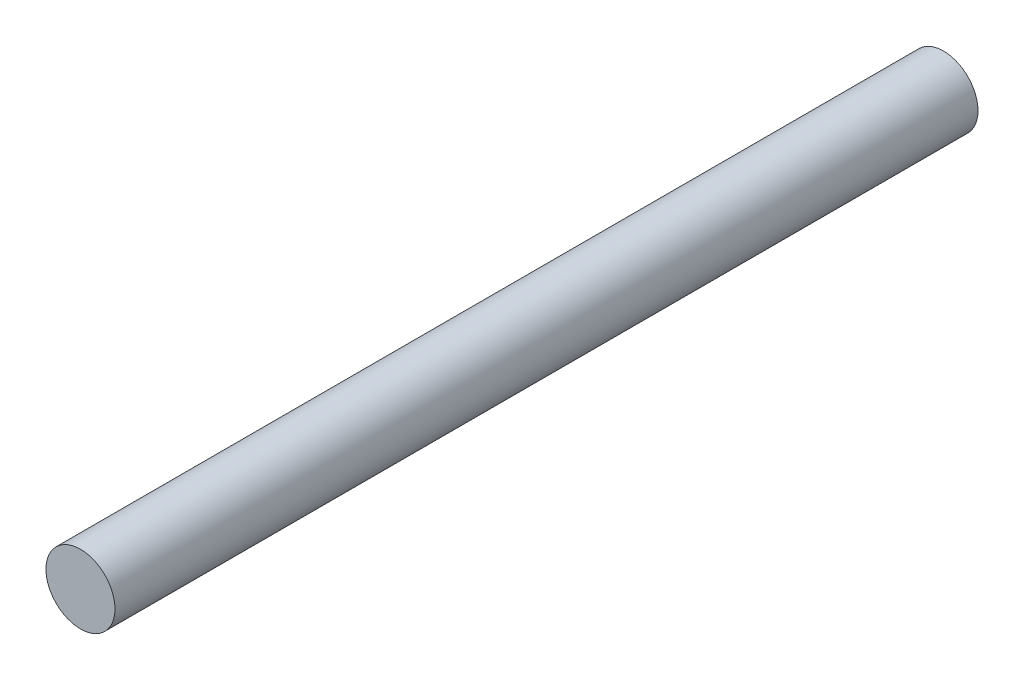
ISO-10303-21;
HEADER;
FILE_DESCRIPTION(('STEP AP214'),'2;1');
FILE_NAME('part.step','',(''),(''),'','','');
FILE_SCHEMA(('AUTOMOTIVE_DESIGN { 1 0 10303 214 1 1 1 1 }'));
ENDSEC;
DATA;
#1=APPLICATION_CONTEXT('core data for automotive mechanical design processes');
#2=APPLICATION_PROTOCOL_DEFINITION('international standard','automotive_design',2000,#1);
#3=PRODUCT_CONTEXT('',#1,'mechanical');
#4=PRODUCT('Part','Part','',(#3));
#5=PRODUCT_RELATED_PRODUCT_CATEGORY('part','',(#4));
#6=PRODUCT_DEFINITION_FORMATION('','',#4);
#7=PRODUCT_DEFINITION_CONTEXT('part definition',#1,'design');
#8=PRODUCT_DEFINITION('design','',#6,#7);
#9=PRODUCT_DEFINITION_SHAPE('','',#8);
#10=(LENGTH_UNIT() NAMED_UNIT(*) SI_UNIT(.MILLI.,.METRE.));
#11=(NAMED_UNIT(*) PLANE_ANGLE_UNIT() SI_UNIT($,.RADIAN.));
#12=(NAMED_UNIT(*) SI_UNIT($,.STERADIAN.) SOLID_ANGLE_UNIT());
#13=UNCERTAINTY_MEASURE_WITH_UNIT(LENGTH_MEASURE(1.E-05),#10,'distance_accuracy_value','');
#14=(GEOMETRIC_REPRESENTATION_CONTEXT(3) GLOBAL_UNCERTAINTY_ASSIGNED_CONTEXT((#13)) GLOBAL_UNIT_ASSIGNED_CONTEXT((#10,
#11,#12)) REPRESENTATION_CONTEXT('',''));
#15=CARTESIAN_POINT('',(0.,0.,0.));
#16=DIRECTION('',(0.,0.,1.));
#17=DIRECTION('',(1.,0.,0.));
#18=AXIS2_PLACEMENT_3D('',#15,#16,#17);
#19=CARTESIAN_POINT('',(0.,0.,100.));
#20=DIRECTION('',(0.,0.,-1.));
#21=DIRECTION('',(-1.,0.,0.));
#22=AXIS2_PLACEMENT_3D('',#19,#20,#21);
#23=CYLINDRICAL_SURFACE('',#22,4.);
#24=CARTESIAN_POINT('',(0.,0.,100.));
#25=DIRECTION('',(0.,0.,1.));
#26=DIRECTION('',(1.,0.,0.));
#27=AXIS2_PLACEMENT_3D('',#24,#25,#26);
#28=CIRCLE('',#27,4.);
#29=CARTESIAN_POINT('',(4.,0.,100.));
#30=VERTEX_POINT('',#29);
#31=EDGE_CURVE('E10',#30,#30,#28,.T.);
#32=ORIENTED_EDGE('',*,*,#31,.F.);
#33=EDGE_LOOP('',(#32));
#34=FACE_BOUND('',#33,.T.);
#35=CARTESIAN_POINT('',(0.,0.,0.));
#36=DIRECTION('',(0.,0.,1.));
#37=DIRECTION('',(1.,0.,0.));
#38=AXIS2_PLACEMENT_3D('',#35,#36,#37);
#39=CIRCLE('',#38,4.);
#40=CARTESIAN_POINT('',(4.,0.,0.));
#41=VERTEX_POINT('',#40);
#42=EDGE_CURVE('E35',#41,#41,#39,.T.);
#43=ORIENTED_EDGE('',*,*,#42,.T.);
#44=EDGE_LOOP('',(#43));
#45=FACE_BOUND('',#44,.T.);
#46=ADVANCED_FACE('F32',(#34,#45),#23,.T.);
#47=CARTESIAN_POINT('',(0.,0.,100.));
#48=DIRECTION('',(0.,0.,1.));
#49=DIRECTION('',(1.,0.,0.));
#50=AXIS2_PLACEMENT_3D('',#47,#48,#49);
#51=PLANE('',#50);
#52=ORIENTED_EDGE('',*,*,#31,.T.);
#53=EDGE_LOOP('',(#52));
#54=FACE_BOUND('',#53,.T.);
#55=ADVANCED_FACE('F47',(#54),#51,.T.);
#56=CARTESIAN_POINT('',(0.,0.,0.));
#57=DIRECTION('',(0.,0.,1.));
#58=DIRECTION('',(1.,0.,0.));
#59=AXIS2_PLACEMENT_3D('',#56,#57,#58);
#60=PLANE('',#59);
#61=ORIENTED_EDGE('',*,*,#42,.F.);
#62=EDGE_LOOP('',(#61));
#63=FACE_BOUND('',#62,.T.);
#64=ADVANCED_FACE('F45',(#63),#60,.F.);
#65=CLOSED_SHELL('',(#46,#55,#64));
#66=MANIFOLD_SOLID_BREP('B2',#65);
#67=ADVANCED_BREP_SHAPE_REPRESENTATION('',(#18,#66),#14);
#68=SHAPE_DEFINITION_REPRESENTATION(#9,#67);
ENDSEC;
END-ISO-10303-21;
